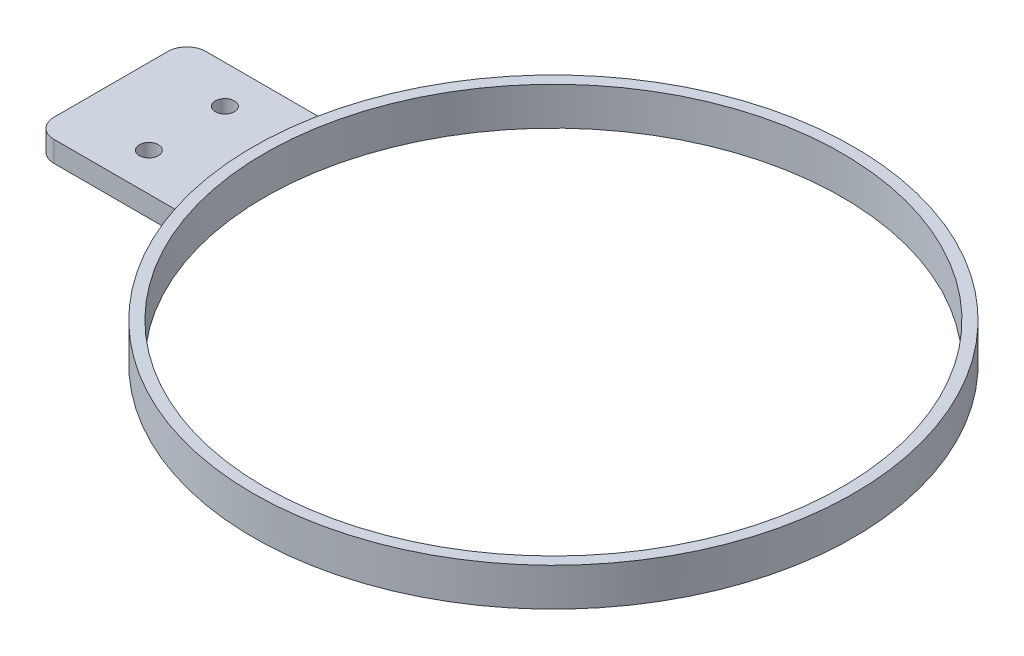
ISO-10303-21;
HEADER;
FILE_DESCRIPTION(('STEP AP214'),'2;1');
FILE_NAME('part.step','',(''),(''),'','','');
FILE_SCHEMA(('AUTOMOTIVE_DESIGN { 1 0 10303 214 1 1 1 1 }'));
ENDSEC;
DATA;
#1=APPLICATION_CONTEXT('core data for automotive mechanical design processes');
#2=APPLICATION_PROTOCOL_DEFINITION('international standard','automotive_design',2000,#1);
#3=PRODUCT_CONTEXT('',#1,'mechanical');
#4=PRODUCT('Part','Part','',(#3));
#5=PRODUCT_RELATED_PRODUCT_CATEGORY('part','',(#4));
#6=PRODUCT_DEFINITION_FORMATION('','',#4);
#7=PRODUCT_DEFINITION_CONTEXT('part definition',#1,'design');
#8=PRODUCT_DEFINITION('design','',#6,#7);
#9=PRODUCT_DEFINITION_SHAPE('','',#8);
#10=(LENGTH_UNIT() NAMED_UNIT(*) SI_UNIT(.MILLI.,.METRE.));
#11=(NAMED_UNIT(*) PLANE_ANGLE_UNIT() SI_UNIT($,.RADIAN.));
#12=(NAMED_UNIT(*) SI_UNIT($,.STERADIAN.) SOLID_ANGLE_UNIT());
#13=UNCERTAINTY_MEASURE_WITH_UNIT(LENGTH_MEASURE(1.E-05),#10,'distance_accuracy_value','');
#14=(GEOMETRIC_REPRESENTATION_CONTEXT(3) GLOBAL_UNCERTAINTY_ASSIGNED_CONTEXT((#13)) GLOBAL_UNIT_ASSIGNED_CONTEXT((#10,
#11,#12)) REPRESENTATION_CONTEXT('',''));
#15=CARTESIAN_POINT('',(0.,0.,0.));
#16=DIRECTION('',(0.,0.,1.));
#17=DIRECTION('',(1.,0.,0.));
#18=AXIS2_PLACEMENT_3D('',#15,#16,#17);
#19=CARTESIAN_POINT('',(0.,10.,0.));
#20=DIRECTION('',(0.,-1.,0.));
#21=DIRECTION('',(0.,0.,-1.));
#22=AXIS2_PLACEMENT_3D('',#19,#20,#21);
#23=CYLINDRICAL_SURFACE('',#22,79.);
#24=CARTESIAN_POINT('',(0.,10.,0.));
#25=DIRECTION('',(0.,1.,0.));
#26=DIRECTION('',(0.,0.,1.));
#27=AXIS2_PLACEMENT_3D('',#24,#25,#26);
#28=CIRCLE('',#27,79.);
#29=CARTESIAN_POINT('',(0.,10.,79.));
#30=VERTEX_POINT('',#29);
#31=EDGE_CURVE('E11',#30,#30,#28,.T.);
#32=ORIENTED_EDGE('',*,*,#31,.F.);
#33=EDGE_LOOP('',(#32));
#34=FACE_BOUND('',#33,.T.);
#35=DIRECTION('',(0.,-1.,0.));
#36=VECTOR('',#35,1.);
#37=CARTESIAN_POINT('',(-76.426435217142,5.5,-20.));
#38=LINE('',#37,#36);
#39=CARTESIAN_POINT('',(-76.426435217142,5.5,-20.));
#40=VERTEX_POINT('',#39);
#41=CARTESIAN_POINT('',(-76.426435217142,0.,-20.));
#42=VERTEX_POINT('',#41);
#43=EDGE_CURVE('E47',#40,#42,#38,.T.);
#44=ORIENTED_EDGE('',*,*,#43,.F.);
#45=CARTESIAN_POINT('',(0.,5.5,0.));
#46=DIRECTION('',(0.,-1.,0.));
#47=DIRECTION('',(0.,0.,1.));
#48=AXIS2_PLACEMENT_3D('',#45,#46,#47);
#49=CIRCLE('',#48,79.);
#50=CARTESIAN_POINT('',(-76.426435217142,5.5,20.));
#51=VERTEX_POINT('',#50);
#52=EDGE_CURVE('E91',#51,#40,#49,.T.);
#53=ORIENTED_EDGE('',*,*,#52,.F.);
#54=DIRECTION('',(0.,-1.,0.));
#55=VECTOR('',#54,1.);
#56=CARTESIAN_POINT('',(-76.426435217142,5.5,20.));
#57=LINE('',#56,#55);
#58=CARTESIAN_POINT('',(-76.426435217142,0.,20.));
#59=VERTEX_POINT('',#58);
#60=EDGE_CURVE('E52',#51,#59,#57,.T.);
#61=ORIENTED_EDGE('',*,*,#60,.T.);
#62=CARTESIAN_POINT('',(0.,0.,0.));
#63=DIRECTION('',(0.,1.,0.));
#64=DIRECTION('',(0.,0.,1.));
#65=AXIS2_PLACEMENT_3D('',#62,#63,#64);
#66=CIRCLE('',#65,79.);
#67=EDGE_CURVE('E36',#59,#42,#66,.T.);
#68=ORIENTED_EDGE('',*,*,#67,.T.);
#69=EDGE_LOOP('',(#44,#53,#61,#68));
#70=FACE_BOUND('',#69,.T.);
#71=ADVANCED_FACE('F33',(#34,#70),#23,.T.);
#72=CARTESIAN_POINT('',(0.,10.,0.));
#73=DIRECTION('',(0.,1.,0.));
#74=DIRECTION('',(0.,0.,1.));
#75=AXIS2_PLACEMENT_3D('',#72,#73,#74);
#76=PLANE('',#75);
#77=ORIENTED_EDGE('',*,*,#31,.T.);
#78=EDGE_LOOP('',(#77));
#79=FACE_BOUND('',#78,.T.);
#80=CARTESIAN_POINT('',(0.,10.,0.));
#81=DIRECTION('',(0.,1.,0.));
#82=DIRECTION('',(0.,0.,1.));
#83=AXIS2_PLACEMENT_3D('',#80,#81,#82);
#84=CIRCLE('',#83,76.);
#85=CARTESIAN_POINT('',(0.,10.,76.));
#86=VERTEX_POINT('',#85);
#87=EDGE_CURVE('E136',#86,#86,#84,.T.);
#88=ORIENTED_EDGE('',*,*,#87,.F.);
#89=EDGE_LOOP('',(#88));
#90=FACE_BOUND('',#89,.T.);
#91=ADVANCED_FACE('F155',(#79,#90),#76,.T.);
#92=CARTESIAN_POINT('',(0.,0.,0.));
#93=DIRECTION('',(0.,1.,0.));
#94=DIRECTION('',(0.,0.,1.));
#95=AXIS2_PLACEMENT_3D('',#92,#93,#94);
#96=PLANE('',#95);
#97=ORIENTED_EDGE('',*,*,#67,.F.);
#98=DIRECTION('',(1.,0.,0.));
#99=VECTOR('',#98,1.);
#100=CARTESIAN_POINT('',(-111.426435217142,0.,20.));
#101=LINE('',#100,#99);
#102=CARTESIAN_POINT('',(-111.426435217142,0.,20.));
#103=VERTEX_POINT('',#102);
#104=EDGE_CURVE('E123',#103,#59,#101,.T.);
#105=ORIENTED_EDGE('',*,*,#104,.F.);
#106=CARTESIAN_POINT('',(-111.426435217142,0.,15.));
#107=DIRECTION('',(0.,1.,0.));
#108=DIRECTION('',(0.,0.,1.));
#109=AXIS2_PLACEMENT_3D('',#106,#107,#108);
#110=CIRCLE('',#109,5.);
#111=CARTESIAN_POINT('',(-116.426435217142,0.,15.));
#112=VERTEX_POINT('',#111);
#113=EDGE_CURVE('E121',#112,#103,#110,.T.);
#114=ORIENTED_EDGE('',*,*,#113,.F.);
#115=DIRECTION('',(0.,0.,1.));
#116=VECTOR('',#115,1.);
#117=CARTESIAN_POINT('',(-116.426435217142,0.,-15.));
#118=LINE('',#117,#116);
#119=CARTESIAN_POINT('',(-116.426435217142,0.,-15.));
#120=VERTEX_POINT('',#119);
#121=EDGE_CURVE('E119',#120,#112,#118,.T.);
#122=ORIENTED_EDGE('',*,*,#121,.F.);
#123=CARTESIAN_POINT('',(-111.426435217142,0.,-15.));
#124=DIRECTION('',(0.,1.,0.));
#125=DIRECTION('',(0.,0.,1.));
#126=AXIS2_PLACEMENT_3D('',#123,#124,#125);
#127=CIRCLE('',#126,5.);
#128=CARTESIAN_POINT('',(-111.426435217142,0.,-20.));
#129=VERTEX_POINT('',#128);
#130=EDGE_CURVE('E116',#129,#120,#127,.T.);
#131=ORIENTED_EDGE('',*,*,#130,.F.);
#132=DIRECTION('',(-1.,0.,0.));
#133=VECTOR('',#132,1.);
#134=CARTESIAN_POINT('',(-76.426435217142,0.,-20.));
#135=LINE('',#134,#133);
#136=EDGE_CURVE('E98',#42,#129,#135,.T.);
#137=ORIENTED_EDGE('',*,*,#136,.F.);
#138=EDGE_LOOP('',(#97,#105,#114,#122,#131,#137));
#139=FACE_BOUND('',#138,.T.);
#140=CARTESIAN_POINT('',(0.,0.,0.));
#141=DIRECTION('',(0.,1.,0.));
#142=DIRECTION('',(0.,0.,1.));
#143=AXIS2_PLACEMENT_3D('',#140,#141,#142);
#144=CIRCLE('',#143,76.);
#145=CARTESIAN_POINT('',(0.,0.,76.));
#146=VERTEX_POINT('',#145);
#147=EDGE_CURVE('E135',#146,#146,#144,.T.);
#148=ORIENTED_EDGE('',*,*,#147,.T.);
#149=EDGE_LOOP('',(#148));
#150=FACE_BOUND('',#149,.T.);
#151=CARTESIAN_POINT('',(-96.426435217142,0.,-10.));
#152=DIRECTION('',(0.,1.,0.));
#153=DIRECTION('',(0.,0.,1.));
#154=AXIS2_PLACEMENT_3D('',#151,#152,#153);
#155=CIRCLE('',#154,2.4998911853393);
#156=CARTESIAN_POINT('',(-96.426435217142,0.,-7.50010881466071));
#157=VERTEX_POINT('',#156);
#158=EDGE_CURVE('E261',#157,#157,#155,.T.);
#159=ORIENTED_EDGE('',*,*,#158,.T.);
#160=EDGE_LOOP('',(#159));
#161=FACE_BOUND('',#160,.T.);
#162=CARTESIAN_POINT('',(-96.426435217142,0.,10.));
#163=DIRECTION('',(0.,1.,0.));
#164=DIRECTION('',(0.,0.,1.));
#165=AXIS2_PLACEMENT_3D('',#162,#163,#164);
#166=CIRCLE('',#165,2.49999999999999);
#167=CARTESIAN_POINT('',(-96.426435217142,0.,12.5));
#168=VERTEX_POINT('',#167);
#169=EDGE_CURVE('E258',#168,#168,#166,.T.);
#170=ORIENTED_EDGE('',*,*,#169,.T.);
#171=EDGE_LOOP('',(#170));
#172=FACE_BOUND('',#171,.T.);
#173=ADVANCED_FACE('F142',(#139,#150,#161,#172),#96,.F.);
#174=CARTESIAN_POINT('',(0.,10.,0.));
#175=DIRECTION('',(0.,-1.,0.));
#176=DIRECTION('',(0.,0.,-1.));
#177=AXIS2_PLACEMENT_3D('',#174,#175,#176);
#178=CYLINDRICAL_SURFACE('',#177,76.);
#179=ORIENTED_EDGE('',*,*,#87,.T.);
#180=EDGE_LOOP('',(#179));
#181=FACE_BOUND('',#180,.T.);
#182=ORIENTED_EDGE('',*,*,#147,.F.);
#183=EDGE_LOOP('',(#182));
#184=FACE_BOUND('',#183,.T.);
#185=ADVANCED_FACE('F145',(#181,#184),#178,.F.);
#186=CARTESIAN_POINT('',(0.,5.5,0.));
#187=DIRECTION('',(0.,1.,0.));
#188=DIRECTION('',(0.,0.,1.));
#189=AXIS2_PLACEMENT_3D('',#186,#187,#188);
#190=PLANE('',#189);
#191=CARTESIAN_POINT('',(-96.426435217142,5.5,-10.));
#192=DIRECTION('',(0.,1.,0.));
#193=DIRECTION('',(0.,0.,1.));
#194=AXIS2_PLACEMENT_3D('',#191,#192,#193);
#195=CIRCLE('',#194,2.4998911853393);
#196=CARTESIAN_POINT('',(-96.426435217142,5.5,-7.50010881466071));
#197=VERTEX_POINT('',#196);
#198=EDGE_CURVE('E117',#197,#197,#195,.T.);
#199=ORIENTED_EDGE('',*,*,#198,.F.);
#200=EDGE_LOOP('',(#199));
#201=FACE_BOUND('',#200,.T.);
#202=ORIENTED_EDGE('',*,*,#52,.T.);
#203=DIRECTION('',(-1.,0.,0.));
#204=VECTOR('',#203,1.);
#205=CARTESIAN_POINT('',(-76.426435217142,5.5,-20.));
#206=LINE('',#205,#204);
#207=CARTESIAN_POINT('',(-111.426435217142,5.5,-20.));
#208=VERTEX_POINT('',#207);
#209=EDGE_CURVE('E83',#40,#208,#206,.T.);
#210=ORIENTED_EDGE('',*,*,#209,.T.);
#211=CARTESIAN_POINT('',(-111.426435217142,5.5,-15.));
#212=DIRECTION('',(0.,1.,0.));
#213=DIRECTION('',(0.,0.,1.));
#214=AXIS2_PLACEMENT_3D('',#211,#212,#213);
#215=CIRCLE('',#214,5.);
#216=CARTESIAN_POINT('',(-116.426435217142,5.5,-15.));
#217=VERTEX_POINT('',#216);
#218=EDGE_CURVE('E88',#208,#217,#215,.T.);
#219=ORIENTED_EDGE('',*,*,#218,.T.);
#220=DIRECTION('',(0.,0.,1.));
#221=VECTOR('',#220,1.);
#222=CARTESIAN_POINT('',(-116.426435217142,5.5,-15.));
#223=LINE('',#222,#221);
#224=CARTESIAN_POINT('',(-116.426435217142,5.5,15.));
#225=VERTEX_POINT('',#224);
#226=EDGE_CURVE('E106',#217,#225,#223,.T.);
#227=ORIENTED_EDGE('',*,*,#226,.T.);
#228=CARTESIAN_POINT('',(-111.426435217142,5.5,15.));
#229=DIRECTION('',(0.,1.,0.));
#230=DIRECTION('',(0.,0.,1.));
#231=AXIS2_PLACEMENT_3D('',#228,#229,#230);
#232=CIRCLE('',#231,5.);
#233=CARTESIAN_POINT('',(-111.426435217142,5.5,20.));
#234=VERTEX_POINT('',#233);
#235=EDGE_CURVE('E108',#225,#234,#232,.T.);
#236=ORIENTED_EDGE('',*,*,#235,.T.);
#237=DIRECTION('',(1.,0.,0.));
#238=VECTOR('',#237,1.);
#239=CARTESIAN_POINT('',(-111.426435217142,5.5,20.));
#240=LINE('',#239,#238);
#241=EDGE_CURVE('E113',#234,#51,#240,.T.);
#242=ORIENTED_EDGE('',*,*,#241,.T.);
#243=EDGE_LOOP('',(#202,#210,#219,#227,#236,#242));
#244=FACE_BOUND('',#243,.T.);
#245=CARTESIAN_POINT('',(-96.426435217142,5.5,10.));
#246=DIRECTION('',(0.,1.,0.));
#247=DIRECTION('',(0.,0.,1.));
#248=AXIS2_PLACEMENT_3D('',#245,#246,#247);
#249=CIRCLE('',#248,2.49999999999999);
#250=CARTESIAN_POINT('',(-96.426435217142,5.5,12.5));
#251=VERTEX_POINT('',#250);
#252=EDGE_CURVE('E255',#251,#251,#249,.T.);
#253=ORIENTED_EDGE('',*,*,#252,.F.);
#254=EDGE_LOOP('',(#253));
#255=FACE_BOUND('',#254,.T.);
#256=ADVANCED_FACE('F85',(#201,#244,#255),#190,.T.);
#257=CARTESIAN_POINT('',(-76.426435217142,5.5,-20.));
#258=DIRECTION('',(0.,0.,1.));
#259=DIRECTION('',(1.,0.,0.));
#260=AXIS2_PLACEMENT_3D('',#257,#258,#259);
#261=PLANE('',#260);
#262=ORIENTED_EDGE('',*,*,#136,.T.);
#263=DIRECTION('',(0.,-1.,0.));
#264=VECTOR('',#263,1.);
#265=CARTESIAN_POINT('',(-111.426435217142,5.5,-20.));
#266=LINE('',#265,#264);
#267=EDGE_CURVE('E95',#208,#129,#266,.T.);
#268=ORIENTED_EDGE('',*,*,#267,.F.);
#269=ORIENTED_EDGE('',*,*,#209,.F.);
#270=ORIENTED_EDGE('',*,*,#43,.T.);
#271=EDGE_LOOP('',(#262,#268,#269,#270));
#272=FACE_BOUND('',#271,.T.);
#273=ADVANCED_FACE('F96',(#272),#261,.F.);
#274=CARTESIAN_POINT('',(-111.426435217142,5.5,-15.));
#275=DIRECTION('',(0.,-1.,0.));
#276=DIRECTION('',(0.,0.,-1.));
#277=AXIS2_PLACEMENT_3D('',#274,#275,#276);
#278=CYLINDRICAL_SURFACE('',#277,5.);
#279=ORIENTED_EDGE('',*,*,#130,.T.);
#280=DIRECTION('',(0.,-1.,0.));
#281=VECTOR('',#280,1.);
#282=CARTESIAN_POINT('',(-116.426435217142,5.5,-15.));
#283=LINE('',#282,#281);
#284=EDGE_CURVE('E101',#217,#120,#283,.T.);
#285=ORIENTED_EDGE('',*,*,#284,.F.);
#286=ORIENTED_EDGE('',*,*,#218,.F.);
#287=ORIENTED_EDGE('',*,*,#267,.T.);
#288=EDGE_LOOP('',(#279,#285,#286,#287));
#289=FACE_BOUND('',#288,.T.);
#290=ADVANCED_FACE('F103',(#289),#278,.T.);
#291=CARTESIAN_POINT('',(-116.426435217142,5.5,-15.));
#292=DIRECTION('',(1.,0.,0.));
#293=DIRECTION('',(0.,0.,-1.));
#294=AXIS2_PLACEMENT_3D('',#291,#292,#293);
#295=PLANE('',#294);
#296=ORIENTED_EDGE('',*,*,#121,.T.);
#297=DIRECTION('',(0.,-1.,0.));
#298=VECTOR('',#297,1.);
#299=CARTESIAN_POINT('',(-116.426435217142,5.5,15.));
#300=LINE('',#299,#298);
#301=EDGE_CURVE('E130',#225,#112,#300,.T.);
#302=ORIENTED_EDGE('',*,*,#301,.F.);
#303=ORIENTED_EDGE('',*,*,#226,.F.);
#304=ORIENTED_EDGE('',*,*,#284,.T.);
#305=EDGE_LOOP('',(#296,#302,#303,#304));
#306=FACE_BOUND('',#305,.T.);
#307=ADVANCED_FACE('F199',(#306),#295,.F.);
#308=CARTESIAN_POINT('',(-111.426435217142,5.5,15.));
#309=DIRECTION('',(0.,-1.,0.));
#310=DIRECTION('',(0.,0.,-1.));
#311=AXIS2_PLACEMENT_3D('',#308,#309,#310);
#312=CYLINDRICAL_SURFACE('',#311,5.);
#313=ORIENTED_EDGE('',*,*,#113,.T.);
#314=DIRECTION('',(0.,-1.,0.));
#315=VECTOR('',#314,1.);
#316=CARTESIAN_POINT('',(-111.426435217142,5.5,20.));
#317=LINE('',#316,#315);
#318=EDGE_CURVE('E127',#234,#103,#317,.T.);
#319=ORIENTED_EDGE('',*,*,#318,.F.);
#320=ORIENTED_EDGE('',*,*,#235,.F.);
#321=ORIENTED_EDGE('',*,*,#301,.T.);
#322=EDGE_LOOP('',(#313,#319,#320,#321));
#323=FACE_BOUND('',#322,.T.);
#324=ADVANCED_FACE('F208',(#323),#312,.T.);
#325=CARTESIAN_POINT('',(-111.426435217142,5.5,20.));
#326=DIRECTION('',(0.,0.,-1.));
#327=DIRECTION('',(-1.,0.,0.));
#328=AXIS2_PLACEMENT_3D('',#325,#326,#327);
#329=PLANE('',#328);
#330=ORIENTED_EDGE('',*,*,#104,.T.);
#331=ORIENTED_EDGE('',*,*,#60,.F.);
#332=ORIENTED_EDGE('',*,*,#241,.F.);
#333=ORIENTED_EDGE('',*,*,#318,.T.);
#334=EDGE_LOOP('',(#330,#331,#332,#333));
#335=FACE_BOUND('',#334,.T.);
#336=ADVANCED_FACE('F218',(#335),#329,.F.);
#337=CARTESIAN_POINT('',(-96.426435217142,5.5,-10.));
#338=DIRECTION('',(0.,-1.,0.));
#339=DIRECTION('',(0.,0.,-1.));
#340=AXIS2_PLACEMENT_3D('',#337,#338,#339);
#341=CYLINDRICAL_SURFACE('',#340,2.4998911853393);
#342=ORIENTED_EDGE('',*,*,#198,.T.);
#343=EDGE_LOOP('',(#342));
#344=FACE_BOUND('',#343,.T.);
#345=ORIENTED_EDGE('',*,*,#158,.F.);
#346=EDGE_LOOP('',(#345));
#347=FACE_BOUND('',#346,.T.);
#348=ADVANCED_FACE('F228',(#344,#347),#341,.F.);
#349=CARTESIAN_POINT('',(-96.426435217142,5.5,10.));
#350=DIRECTION('',(0.,-1.,0.));
#351=DIRECTION('',(0.,0.,-1.));
#352=AXIS2_PLACEMENT_3D('',#349,#350,#351);
#353=CYLINDRICAL_SURFACE('',#352,2.49999999999999);
#354=ORIENTED_EDGE('',*,*,#252,.T.);
#355=EDGE_LOOP('',(#354));
#356=FACE_BOUND('',#355,.T.);
#357=ORIENTED_EDGE('',*,*,#169,.F.);
#358=EDGE_LOOP('',(#357));
#359=FACE_BOUND('',#358,.T.);
#360=ADVANCED_FACE('F238',(#356,#359),#353,.F.);
#361=CLOSED_SHELL('',(#71,#91,#173,#185,#256,#273,#290,#307,#324,#336,#348,#360));
#362=MANIFOLD_SOLID_BREP('B2',#361);
#363=ADVANCED_BREP_SHAPE_REPRESENTATION('',(#18,#362),#14);
#364=SHAPE_DEFINITION_REPRESENTATION(#9,#363);
ENDSEC;
END-ISO-10303-21;
